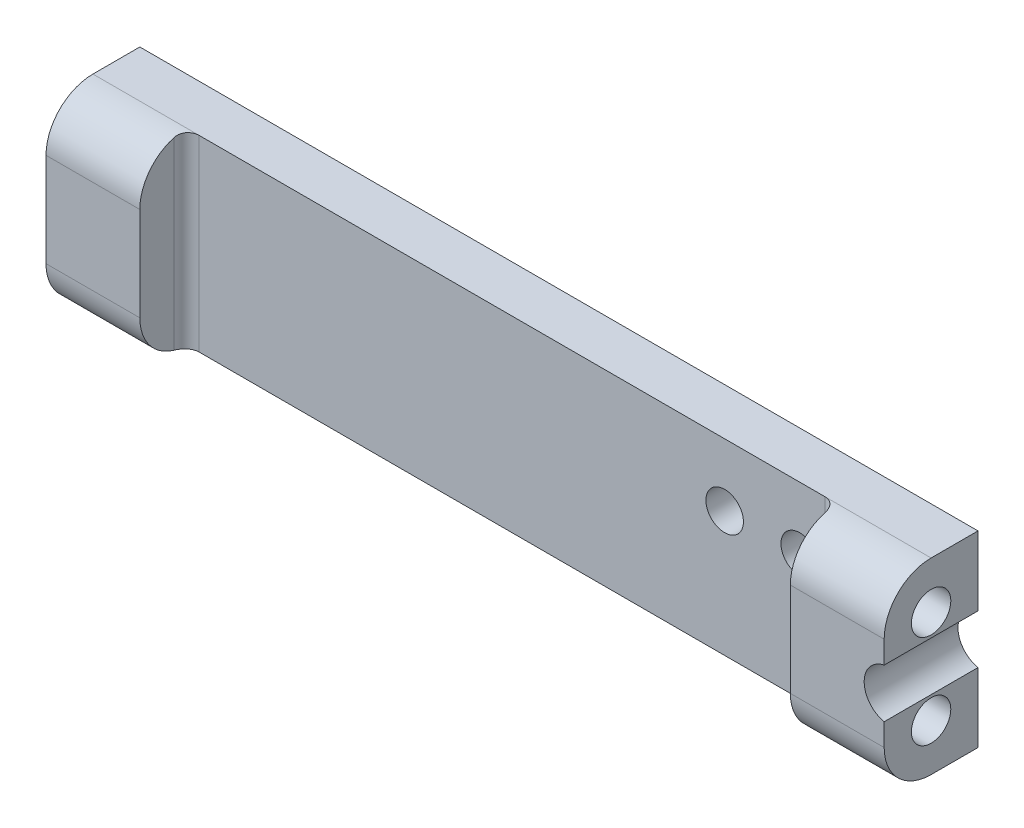
ISO-10303-21;
HEADER;
FILE_DESCRIPTION(('STEP AP214'),'2;1');
FILE_NAME('part.step','',(''),(''),'','','');
FILE_SCHEMA(('AUTOMOTIVE_DESIGN { 1 0 10303 214 1 1 1 1 }'));
ENDSEC;
DATA;
#1=APPLICATION_CONTEXT('core data for automotive mechanical design processes');
#2=APPLICATION_PROTOCOL_DEFINITION('international standard','automotive_design',2000,#1);
#3=PRODUCT_CONTEXT('',#1,'mechanical');
#4=PRODUCT('Part','Part','',(#3));
#5=PRODUCT_RELATED_PRODUCT_CATEGORY('part','',(#4));
#6=PRODUCT_DEFINITION_FORMATION('','',#4);
#7=PRODUCT_DEFINITION_CONTEXT('part definition',#1,'design');
#8=PRODUCT_DEFINITION('design','',#6,#7);
#9=PRODUCT_DEFINITION_SHAPE('','',#8);
#10=(LENGTH_UNIT() NAMED_UNIT(*) SI_UNIT(.MILLI.,.METRE.));
#11=(NAMED_UNIT(*) PLANE_ANGLE_UNIT() SI_UNIT($,.RADIAN.));
#12=(NAMED_UNIT(*) SI_UNIT($,.STERADIAN.) SOLID_ANGLE_UNIT());
#13=UNCERTAINTY_MEASURE_WITH_UNIT(LENGTH_MEASURE(1.E-05),#10,'distance_accuracy_value','');
#14=(GEOMETRIC_REPRESENTATION_CONTEXT(3) GLOBAL_UNCERTAINTY_ASSIGNED_CONTEXT((#13)) GLOBAL_UNIT_ASSIGNED_CONTEXT((#10,
#11,#12)) REPRESENTATION_CONTEXT('',''));
#15=CARTESIAN_POINT('',(0.,0.,0.));
#16=DIRECTION('',(0.,0.,1.));
#17=DIRECTION('',(1.,0.,0.));
#18=AXIS2_PLACEMENT_3D('',#15,#16,#17);
#19=CARTESIAN_POINT('',(53.281794946529,32.1184940800071,-52.0539798077196));
#20=DIRECTION('',(-1.,0.,0.));
#21=DIRECTION('',(0.,0.,1.));
#22=AXIS2_PLACEMENT_3D('',#19,#20,#21);
#23=PLANE('',#22);
#24=CARTESIAN_POINT('',(53.281794946529,46.4059940800071,-52.0539798077196));
#25=DIRECTION('',(-1.,0.,0.));
#26=DIRECTION('',(0.,0.,1.));
#27=AXIS2_PLACEMENT_3D('',#24,#25,#26);
#28=CIRCLE('',#27,2.);
#29=CARTESIAN_POINT('',(53.281794946529,46.4059940800071,-50.0539798077196));
#30=VERTEX_POINT('',#29);
#31=EDGE_CURVE('E381',#30,#30,#28,.T.);
#32=ORIENTED_EDGE('',*,*,#31,.T.);
#33=EDGE_LOOP('',(#32));
#34=FACE_BOUND('',#33,.T.);
#35=DIRECTION('',(0.,-1.,0.));
#36=VECTOR('',#35,1.);
#37=CARTESIAN_POINT('',(53.281794946529,32.1184940800071,-47.2914798077196));
#38=LINE('',#37,#36);
#39=CARTESIAN_POINT('',(53.281794946529,46.4059940800071,-47.2914798077196));
#40=VERTEX_POINT('',#39);
#41=CARTESIAN_POINT('',(53.281794946529,44.1321756586748,-47.2914798077196));
#42=VERTEX_POINT('',#41);
#43=EDGE_CURVE('E169',#40,#42,#38,.T.);
#44=ORIENTED_EDGE('',*,*,#43,.T.);
#45=DIRECTION('',(0.,0.,-1.));
#46=VECTOR('',#45,1.);
#47=CARTESIAN_POINT('',(53.281794946529,44.1321756586748,7.31852019228041));
#48=LINE('',#47,#46);
#49=CARTESIAN_POINT('',(53.281794946529,44.1321756586748,-56.8164798077196));
#50=VERTEX_POINT('',#49);
#51=EDGE_CURVE('E68',#42,#50,#48,.T.);
#52=ORIENTED_EDGE('',*,*,#51,.T.);
#53=DIRECTION('',(0.,1.,0.));
#54=VECTOR('',#53,1.);
#55=CARTESIAN_POINT('',(53.281794946529,32.1184940800071,-56.8164798077196));
#56=LINE('',#55,#54);
#57=CARTESIAN_POINT('',(53.281794946529,51.1684940800071,-56.8164798077196));
#58=VERTEX_POINT('',#57);
#59=EDGE_CURVE('E166',#50,#58,#56,.T.);
#60=ORIENTED_EDGE('',*,*,#59,.T.);
#61=DIRECTION('',(0.,0.,-1.));
#62=VECTOR('',#61,1.);
#63=CARTESIAN_POINT('',(53.281794946529,51.1684940800071,-52.0539798077196));
#64=LINE('',#63,#62);
#65=CARTESIAN_POINT('',(53.281794946529,51.1684940800071,-52.0539798077196));
#66=VERTEX_POINT('',#65);
#67=EDGE_CURVE('E193',#66,#58,#64,.T.);
#68=ORIENTED_EDGE('',*,*,#67,.F.);
#69=CARTESIAN_POINT('',(53.281794946529,46.4059940800071,-52.0539798077196));
#70=DIRECTION('',(-1.,0.,0.));
#71=DIRECTION('',(0.,0.,1.));
#72=AXIS2_PLACEMENT_3D('',#69,#70,#71);
#73=CIRCLE('',#72,4.7625);
#74=EDGE_CURVE('E324',#40,#66,#73,.T.);
#75=ORIENTED_EDGE('',*,*,#74,.F.);
#76=EDGE_LOOP('',(#44,#52,#60,#68,#75));
#77=FACE_BOUND('',#76,.T.);
#78=ADVANCED_FACE('F53',(#34,#77),#23,.F.);
#79=CARTESIAN_POINT('',(-31.808205053471,32.1184940800071,-52.0539798077196));
#80=DIRECTION('',(0.,0.,1.));
#81=DIRECTION('',(1.,0.,0.));
#82=AXIS2_PLACEMENT_3D('',#79,#80,#81);
#83=PLANE('',#82);
#84=CARTESIAN_POINT('',(32.3267949465289,44.8184940800071,-52.0539798077196));
#85=DIRECTION('',(0.,0.,1.));
#86=DIRECTION('',(1.,0.,0.));
#87=AXIS2_PLACEMENT_3D('',#84,#85,#86);
#88=CIRCLE('',#87,1.90500000000001);
#89=CARTESIAN_POINT('',(34.231794946529,44.8184940800071,-52.0539798077196));
#90=VERTEX_POINT('',#89);
#91=EDGE_CURVE('E203',#90,#90,#88,.T.);
#92=ORIENTED_EDGE('',*,*,#91,.F.);
#93=EDGE_LOOP('',(#92));
#94=FACE_BOUND('',#93,.T.);
#95=CARTESIAN_POINT('',(39.946794946529,44.8184940800071,-52.0539798077196));
#96=DIRECTION('',(0.,0.,1.));
#97=DIRECTION('',(1.,0.,0.));
#98=AXIS2_PLACEMENT_3D('',#95,#96,#97);
#99=CIRCLE('',#98,1.90500000000001);
#100=CARTESIAN_POINT('',(41.851794946529,44.8184940800071,-52.0539798077196));
#101=VERTEX_POINT('',#100);
#102=EDGE_CURVE('E170',#101,#101,#99,.T.);
#103=ORIENTED_EDGE('',*,*,#102,.F.);
#104=EDGE_LOOP('',(#103));
#105=FACE_BOUND('',#104,.T.);
#106=DIRECTION('',(1.,0.,0.));
#107=VECTOR('',#106,1.);
#108=CARTESIAN_POINT('',(-31.808205053471,32.1184940800071,-52.0539798077196));
#109=LINE('',#108,#107);
#110=CARTESIAN_POINT('',(-21.013205053471,32.1184940800071,-52.0539798077196));
#111=VERTEX_POINT('',#110);
#112=CARTESIAN_POINT('',(42.486794946529,32.1184940800071,-52.0539798077196));
#113=VERTEX_POINT('',#112);
#114=EDGE_CURVE('E293',#111,#113,#109,.T.);
#115=ORIENTED_EDGE('',*,*,#114,.T.);
#116=DIRECTION('',(0.,1.,0.));
#117=VECTOR('',#116,1.);
#118=CARTESIAN_POINT('',(42.486794946529,32.1184940800071,-52.0539798077196));
#119=LINE('',#118,#117);
#120=CARTESIAN_POINT('',(42.486794946529,51.1684940800071,-52.0539798077196));
#121=VERTEX_POINT('',#120);
#122=EDGE_CURVE('E198',#113,#121,#119,.T.);
#123=ORIENTED_EDGE('',*,*,#122,.T.);
#124=DIRECTION('',(1.,0.,0.));
#125=VECTOR('',#124,1.);
#126=CARTESIAN_POINT('',(-31.808205053471,51.1684940800071,-52.0539798077196));
#127=LINE('',#126,#125);
#128=CARTESIAN_POINT('',(-21.013205053471,51.1684940800071,-52.0539798077196));
#129=VERTEX_POINT('',#128);
#130=EDGE_CURVE('E76',#129,#121,#127,.T.);
#131=ORIENTED_EDGE('',*,*,#130,.F.);
#132=DIRECTION('',(0.,-1.,0.));
#133=VECTOR('',#132,1.);
#134=CARTESIAN_POINT('',(-21.013205053471,32.1184940800071,-52.0539798077196));
#135=LINE('',#134,#133);
#136=EDGE_CURVE('E210',#129,#111,#135,.T.);
#137=ORIENTED_EDGE('',*,*,#136,.T.);
#138=EDGE_LOOP('',(#115,#123,#131,#137));
#139=FACE_BOUND('',#138,.T.);
#140=ADVANCED_FACE('F248',(#94,#105,#139),#83,.T.);
#141=CARTESIAN_POINT('',(53.281794946529,36.8809940800071,-52.0539798077196));
#142=DIRECTION('',(1.,0.,0.));
#143=DIRECTION('',(0.,0.,-1.));
#144=AXIS2_PLACEMENT_3D('',#141,#142,#143);
#145=CIRCLE('',#144,2.);
#146=CARTESIAN_POINT('',(53.281794946529,36.8809940800071,-54.0539798077196));
#147=VERTEX_POINT('',#146);
#148=EDGE_CURVE('E206',#147,#147,#145,.T.);
#149=ORIENTED_EDGE('',*,*,#148,.F.);
#150=EDGE_LOOP('',(#149));
#151=FACE_BOUND('',#150,.T.);
#152=CARTESIAN_POINT('',(53.281794946529,32.1184940800071,-56.8164798077196));
#153=VERTEX_POINT('',#152);
#154=CARTESIAN_POINT('',(53.281794946529,39.1548125013394,-56.8164798077196));
#155=VERTEX_POINT('',#154);
#156=EDGE_CURVE('E176',#153,#155,#56,.T.);
#157=ORIENTED_EDGE('',*,*,#156,.T.);
#158=DIRECTION('',(0.,0.,-1.));
#159=VECTOR('',#158,1.);
#160=CARTESIAN_POINT('',(53.281794946529,39.1548125013394,7.31852019228041));
#161=LINE('',#160,#159);
#162=CARTESIAN_POINT('',(53.281794946529,39.1548125013394,-47.2914798077196));
#163=VERTEX_POINT('',#162);
#164=EDGE_CURVE('E157',#155,#163,#161,.F.);
#165=ORIENTED_EDGE('',*,*,#164,.T.);
#166=CARTESIAN_POINT('',(53.281794946529,36.8809940800071,-47.2914798077196));
#167=VERTEX_POINT('',#166);
#168=EDGE_CURVE('E323',#163,#167,#38,.T.);
#169=ORIENTED_EDGE('',*,*,#168,.T.);
#170=CARTESIAN_POINT('',(53.281794946529,36.8809940800071,-52.0539798077196));
#171=DIRECTION('',(1.,0.,0.));
#172=DIRECTION('',(0.,0.,-1.));
#173=AXIS2_PLACEMENT_3D('',#170,#171,#172);
#174=CIRCLE('',#173,4.7625);
#175=CARTESIAN_POINT('',(53.281794946529,32.1184940800071,-52.0539798077196));
#176=VERTEX_POINT('',#175);
#177=EDGE_CURVE('E327',#167,#176,#174,.T.);
#178=ORIENTED_EDGE('',*,*,#177,.T.);
#179=DIRECTION('',(0.,0.,-1.));
#180=VECTOR('',#179,1.);
#181=CARTESIAN_POINT('',(53.281794946529,32.1184940800071,-52.0539798077196));
#182=LINE('',#181,#180);
#183=EDGE_CURVE('E195',#176,#153,#182,.T.);
#184=ORIENTED_EDGE('',*,*,#183,.T.);
#185=EDGE_LOOP('',(#157,#165,#169,#178,#184));
#186=FACE_BOUND('',#185,.T.);
#187=ADVANCED_FACE('F244',(#151,#186),#23,.F.);
#188=CARTESIAN_POINT('',(-31.808205053471,32.1184940800071,-52.0539798077196));
#189=DIRECTION('',(-1.,0.,0.));
#190=DIRECTION('',(0.,0.,1.));
#191=AXIS2_PLACEMENT_3D('',#188,#189,#190);
#192=PLANE('',#191);
#193=CARTESIAN_POINT('',(-31.808205053471,36.8809940800071,-52.0539798077196));
#194=DIRECTION('',(1.,0.,0.));
#195=DIRECTION('',(0.,0.,-1.));
#196=AXIS2_PLACEMENT_3D('',#193,#194,#195);
#197=CIRCLE('',#196,2.);
#198=CARTESIAN_POINT('',(-31.808205053471,36.8809940800071,-54.0539798077196));
#199=VERTEX_POINT('',#198);
#200=EDGE_CURVE('E347',#199,#199,#197,.T.);
#201=ORIENTED_EDGE('',*,*,#200,.T.);
#202=EDGE_LOOP('',(#201));
#203=FACE_BOUND('',#202,.T.);
#204=DIRECTION('',(0.,0.,-1.));
#205=VECTOR('',#204,1.);
#206=CARTESIAN_POINT('',(-31.808205053471,51.1684940800071,-52.0539798077196));
#207=LINE('',#206,#205);
#208=CARTESIAN_POINT('',(-31.808205053471,51.1684940800071,-52.0539798077196));
#209=VERTEX_POINT('',#208);
#210=CARTESIAN_POINT('',(-31.808205053471,51.1684940800071,-56.8164798077196));
#211=VERTEX_POINT('',#210);
#212=EDGE_CURVE('E189',#209,#211,#207,.T.);
#213=ORIENTED_EDGE('',*,*,#212,.T.);
#214=DIRECTION('',(0.,1.,0.));
#215=VECTOR('',#214,1.);
#216=CARTESIAN_POINT('',(-31.808205053471,32.1184940800071,-56.8164798077196));
#217=LINE('',#216,#215);
#218=CARTESIAN_POINT('',(-31.808205053471,32.1184940800071,-56.8164798077196));
#219=VERTEX_POINT('',#218);
#220=EDGE_CURVE('E184',#219,#211,#217,.T.);
#221=ORIENTED_EDGE('',*,*,#220,.F.);
#222=DIRECTION('',(0.,0.,-1.));
#223=VECTOR('',#222,1.);
#224=CARTESIAN_POINT('',(-31.808205053471,32.1184940800071,-52.0539798077196));
#225=LINE('',#224,#223);
#226=CARTESIAN_POINT('',(-31.808205053471,32.1184940800071,-52.0539798077196));
#227=VERTEX_POINT('',#226);
#228=EDGE_CURVE('E187',#227,#219,#225,.T.);
#229=ORIENTED_EDGE('',*,*,#228,.F.);
#230=CARTESIAN_POINT('',(-31.808205053471,36.8809940800071,-52.0539798077196));
#231=DIRECTION('',(1.,0.,0.));
#232=DIRECTION('',(0.,0.,-1.));
#233=AXIS2_PLACEMENT_3D('',#230,#231,#232);
#234=CIRCLE('',#233,4.7625);
#235=CARTESIAN_POINT('',(-31.808205053471,36.8809940800071,-47.2914798077196));
#236=VERTEX_POINT('',#235);
#237=EDGE_CURVE('E343',#236,#227,#234,.T.);
#238=ORIENTED_EDGE('',*,*,#237,.F.);
#239=DIRECTION('',(0.,-1.,0.));
#240=VECTOR('',#239,1.);
#241=CARTESIAN_POINT('',(-31.808205053471,32.1184940800071,-47.2914798077196));
#242=LINE('',#241,#240);
#243=CARTESIAN_POINT('',(-31.808205053471,46.4059940800071,-47.2914798077196));
#244=VERTEX_POINT('',#243);
#245=EDGE_CURVE('E356',#244,#236,#242,.T.);
#246=ORIENTED_EDGE('',*,*,#245,.F.);
#247=CARTESIAN_POINT('',(-31.808205053471,46.4059940800071,-52.0539798077196));
#248=DIRECTION('',(-1.,0.,0.));
#249=DIRECTION('',(0.,0.,1.));
#250=AXIS2_PLACEMENT_3D('',#247,#248,#249);
#251=CIRCLE('',#250,4.7625);
#252=EDGE_CURVE('E362',#244,#209,#251,.T.);
#253=ORIENTED_EDGE('',*,*,#252,.T.);
#254=EDGE_LOOP('',(#213,#221,#229,#238,#246,#253));
#255=FACE_BOUND('',#254,.T.);
#256=CARTESIAN_POINT('',(-31.808205053471,46.4059940800071,-52.0539798077196));
#257=DIRECTION('',(-1.,0.,0.));
#258=DIRECTION('',(0.,0.,1.));
#259=AXIS2_PLACEMENT_3D('',#256,#257,#258);
#260=CIRCLE('',#259,2.);
#261=CARTESIAN_POINT('',(-31.808205053471,46.4059940800071,-50.0539798077196));
#262=VERTEX_POINT('',#261);
#263=EDGE_CURVE('E344',#262,#262,#260,.T.);
#264=ORIENTED_EDGE('',*,*,#263,.F.);
#265=EDGE_LOOP('',(#264));
#266=FACE_BOUND('',#265,.T.);
#267=ADVANCED_FACE('F247',(#203,#255,#266),#192,.T.);
#268=CARTESIAN_POINT('',(-31.808205053471,51.1684940800071,-52.0539798077196));
#269=DIRECTION('',(0.,1.,0.));
#270=DIRECTION('',(-1.,0.,0.));
#271=AXIS2_PLACEMENT_3D('',#268,#269,#270);
#272=PLANE('',#271);
#273=EDGE_CURVE('E190',#209,#129,#127,.T.);
#274=ORIENTED_EDGE('',*,*,#273,.T.);
#275=ORIENTED_EDGE('',*,*,#130,.T.);
#276=DIRECTION('',(1.,0.,0.));
#277=VECTOR('',#276,1.);
#278=CARTESIAN_POINT('',(43.7567949465289,51.1684940800071,-52.0539798077196));
#279=LINE('',#278,#277);
#280=EDGE_CURVE('E318',#66,#121,#279,.F.);
#281=ORIENTED_EDGE('',*,*,#280,.F.);
#282=ORIENTED_EDGE('',*,*,#67,.T.);
#283=DIRECTION('',(1.,0.,0.));
#284=VECTOR('',#283,1.);
#285=CARTESIAN_POINT('',(-31.808205053471,51.1684940800071,-56.8164798077196));
#286=LINE('',#285,#284);
#287=EDGE_CURVE('E174',#211,#58,#286,.T.);
#288=ORIENTED_EDGE('',*,*,#287,.F.);
#289=ORIENTED_EDGE('',*,*,#212,.F.);
#290=EDGE_LOOP('',(#274,#275,#281,#282,#288,#289));
#291=FACE_BOUND('',#290,.T.);
#292=ADVANCED_FACE('F243',(#291),#272,.T.);
#293=CARTESIAN_POINT('',(-31.808205053471,32.1184940800071,-56.8164798077196));
#294=DIRECTION('',(0.,0.,1.));
#295=DIRECTION('',(1.,0.,0.));
#296=AXIS2_PLACEMENT_3D('',#293,#294,#295);
#297=PLANE('',#296);
#298=CARTESIAN_POINT('',(32.3267949465289,44.8184940800071,-56.8164798077196));
#299=DIRECTION('',(0.,0.,1.));
#300=DIRECTION('',(1.,0.,0.));
#301=AXIS2_PLACEMENT_3D('',#298,#299,#300);
#302=CIRCLE('',#301,1.90500000000001);
#303=CARTESIAN_POINT('',(34.231794946529,44.8184940800071,-56.8164798077196));
#304=VERTEX_POINT('',#303);
#305=EDGE_CURVE('E202',#304,#304,#302,.T.);
#306=ORIENTED_EDGE('',*,*,#305,.T.);
#307=EDGE_LOOP('',(#306));
#308=FACE_BOUND('',#307,.T.);
#309=CARTESIAN_POINT('',(39.946794946529,44.8184940800071,-56.8164798077196));
#310=DIRECTION('',(0.,0.,1.));
#311=DIRECTION('',(1.,0.,0.));
#312=AXIS2_PLACEMENT_3D('',#309,#310,#311);
#313=CIRCLE('',#312,1.90500000000001);
#314=CARTESIAN_POINT('',(41.851794946529,44.8184940800071,-56.8164798077196));
#315=VERTEX_POINT('',#314);
#316=EDGE_CURVE('E199',#315,#315,#313,.T.);
#317=ORIENTED_EDGE('',*,*,#316,.T.);
#318=EDGE_LOOP('',(#317));
#319=FACE_BOUND('',#318,.T.);
#320=ORIENTED_EDGE('',*,*,#59,.F.);
#321=CARTESIAN_POINT('',(53.789794946529,41.6434940800071,-56.8164798077196));
#322=DIRECTION('',(0.,0.,-1.));
#323=DIRECTION('',(-1.,0.,0.));
#324=AXIS2_PLACEMENT_3D('',#321,#322,#323);
#325=CIRCLE('',#324,2.54);
#326=EDGE_CURVE('E154',#155,#50,#325,.T.);
#327=ORIENTED_EDGE('',*,*,#326,.F.);
#328=ORIENTED_EDGE('',*,*,#156,.F.);
#329=DIRECTION('',(1.,0.,0.));
#330=VECTOR('',#329,1.);
#331=CARTESIAN_POINT('',(-31.808205053471,32.1184940800071,-56.8164798077196));
#332=LINE('',#331,#330);
#333=EDGE_CURVE('E177',#219,#153,#332,.T.);
#334=ORIENTED_EDGE('',*,*,#333,.F.);
#335=ORIENTED_EDGE('',*,*,#220,.T.);
#336=ORIENTED_EDGE('',*,*,#287,.T.);
#337=EDGE_LOOP('',(#320,#327,#328,#334,#335,#336));
#338=FACE_BOUND('',#337,.T.);
#339=ADVANCED_FACE('F172',(#308,#319,#338),#297,.F.);
#340=CARTESIAN_POINT('',(-31.808205053471,32.1184940800071,-52.0539798077196));
#341=DIRECTION('',(0.,1.,0.));
#342=DIRECTION('',(-1.,0.,0.));
#343=AXIS2_PLACEMENT_3D('',#340,#341,#342);
#344=PLANE('',#343);
#345=ORIENTED_EDGE('',*,*,#333,.T.);
#346=ORIENTED_EDGE('',*,*,#183,.F.);
#347=EDGE_CURVE('E186',#113,#176,#109,.T.);
#348=ORIENTED_EDGE('',*,*,#347,.F.);
#349=ORIENTED_EDGE('',*,*,#114,.F.);
#350=EDGE_CURVE('E298',#227,#111,#109,.T.);
#351=ORIENTED_EDGE('',*,*,#350,.F.);
#352=ORIENTED_EDGE('',*,*,#228,.T.);
#353=EDGE_LOOP('',(#345,#346,#348,#349,#351,#352));
#354=FACE_BOUND('',#353,.T.);
#355=ADVANCED_FACE('F237',(#354),#344,.F.);
#356=CARTESIAN_POINT('',(-22.283205053471,32.1184940800071,-47.2914798077196));
#357=DIRECTION('',(0.,0.,-1.));
#358=DIRECTION('',(-1.,0.,0.));
#359=AXIS2_PLACEMENT_3D('',#356,#357,#358);
#360=PLANE('',#359);
#361=ORIENTED_EDGE('',*,*,#245,.T.);
#362=DIRECTION('',(-1.,0.,0.));
#363=VECTOR('',#362,1.);
#364=CARTESIAN_POINT('',(-22.283205053471,36.8809940800071,-47.2914798077196));
#365=LINE('',#364,#363);
#366=CARTESIAN_POINT('',(-22.283205053471,36.8809940800071,-47.2914798077196));
#367=VERTEX_POINT('',#366);
#368=EDGE_CURVE('E355',#367,#236,#365,.T.);
#369=ORIENTED_EDGE('',*,*,#368,.F.);
#370=DIRECTION('',(0.,-1.,0.));
#371=VECTOR('',#370,1.);
#372=CARTESIAN_POINT('',(-22.283205053471,32.1184940800071,-47.2914798077196));
#373=LINE('',#372,#371);
#374=CARTESIAN_POINT('',(-22.283205053471,46.4059940800071,-47.2914798077196));
#375=VERTEX_POINT('',#374);
#376=EDGE_CURVE('E352',#375,#367,#373,.T.);
#377=ORIENTED_EDGE('',*,*,#376,.F.);
#378=DIRECTION('',(-1.,0.,0.));
#379=VECTOR('',#378,1.);
#380=CARTESIAN_POINT('',(-22.283205053471,46.4059940800071,-47.2914798077196));
#381=LINE('',#380,#379);
#382=EDGE_CURVE('E179',#375,#244,#381,.T.);
#383=ORIENTED_EDGE('',*,*,#382,.T.);
#384=EDGE_LOOP('',(#361,#369,#377,#383));
#385=FACE_BOUND('',#384,.T.);
#386=ADVANCED_FACE('F241',(#385),#360,.F.);
#387=CARTESIAN_POINT('',(-22.283205053471,32.1184940800071,-56.8164798077196));
#388=DIRECTION('',(-1.,0.,0.));
#389=DIRECTION('',(0.,0.,1.));
#390=AXIS2_PLACEMENT_3D('',#387,#388,#389);
#391=PLANE('',#390);
#392=CARTESIAN_POINT('',(-22.283205053471,36.8809940800071,-52.0539798077196));
#393=DIRECTION('',(1.,0.,0.));
#394=DIRECTION('',(0.,0.,-1.));
#395=AXIS2_PLACEMENT_3D('',#392,#393,#394);
#396=CIRCLE('',#395,4.7625);
#397=CARTESIAN_POINT('',(-22.283205053471,32.2909498264078,-50.7839798077196));
#398=VERTEX_POINT('',#397);
#399=EDGE_CURVE('E364',#367,#398,#396,.T.);
#400=ORIENTED_EDGE('',*,*,#399,.T.);
#401=DIRECTION('',(0.,-1.,0.));
#402=VECTOR('',#401,1.);
#403=CARTESIAN_POINT('',(-22.283205053471,32.1184940800071,-50.7839798077196));
#404=LINE('',#403,#402);
#405=CARTESIAN_POINT('',(-22.283205053471,50.9960383336064,-50.7839798077196));
#406=VERTEX_POINT('',#405);
#407=EDGE_CURVE('E212',#398,#406,#404,.F.);
#408=ORIENTED_EDGE('',*,*,#407,.T.);
#409=CARTESIAN_POINT('',(-22.283205053471,46.4059940800071,-52.0539798077196));
#410=DIRECTION('',(-1.,0.,0.));
#411=DIRECTION('',(0.,0.,1.));
#412=AXIS2_PLACEMENT_3D('',#409,#410,#411);
#413=CIRCLE('',#412,4.7625);
#414=EDGE_CURVE('E288',#375,#406,#413,.T.);
#415=ORIENTED_EDGE('',*,*,#414,.F.);
#416=ORIENTED_EDGE('',*,*,#376,.T.);
#417=EDGE_LOOP('',(#400,#408,#415,#416));
#418=FACE_BOUND('',#417,.T.);
#419=ADVANCED_FACE('F267',(#418),#391,.F.);
#420=CARTESIAN_POINT('',(-22.283205053471,36.8809940800071,-52.0539798077196));
#421=DIRECTION('',(-1.,0.,0.));
#422=DIRECTION('',(0.,0.,1.));
#423=AXIS2_PLACEMENT_3D('',#420,#421,#422);
#424=CYLINDRICAL_SURFACE('',#423,4.7625);
#425=ORIENTED_EDGE('',*,*,#350,.T.);
#426=CARTESIAN_POINT('',(-21.013205053471,32.1184940800071,-52.0539798077196));
#427=CARTESIAN_POINT('',(-21.0489110338554,32.1184963897941,-52.0539795668819));
#428=CARTESIAN_POINT('',(-21.0845999155025,32.1184938201469,-52.052473055808));
#429=CARTESIAN_POINT('',(-21.1557227559325,32.1184986140629,-52.0464629353868));
#430=CARTESIAN_POINT('',(-21.1911567261077,32.1185059771793,-52.0419594608317));
#431=CARTESIAN_POINT('',(-21.2966427060577,32.1185724318406,-52.0239948283694));
#432=CARTESIAN_POINT('',(-21.3659889989472,32.1186757757917,-52.0060793533094));
#433=CARTESIAN_POINT('',(-21.5006917399608,32.1193860829967,-51.958866969165));
#434=CARTESIAN_POINT('',(-21.5660460972042,32.1199933077837,-51.9295641538237));
#435=CARTESIAN_POINT('',(-21.6908980677984,32.1223039124437,-51.8604183987805));
#436=CARTESIAN_POINT('',(-21.7503966555477,32.1240071095906,-51.8205772167424));
#437=CARTESIAN_POINT('',(-21.8616557421564,32.1292065584722,-51.7316552038856));
#438=CARTESIAN_POINT('',(-21.9134386877719,32.1326974723839,-51.6826021527378));
#439=CARTESIAN_POINT('',(-22.0079836727921,32.1421757518259,-51.5766671797731));
#440=CARTESIAN_POINT('',(-22.0507465971655,32.1481628722775,-51.5197860268896));
#441=CARTESIAN_POINT('',(-22.125596393424,32.1631329225431,-51.4007227690563));
#442=CARTESIAN_POINT('',(-22.1578064828574,32.1720786293185,-51.3386133402348));
#443=CARTESIAN_POINT('',(-22.211475368434,32.1933438004726,-51.210443615872));
#444=CARTESIAN_POINT('',(-22.232935275521,32.2056629160333,-51.1443837293684));
#445=CARTESIAN_POINT('',(-22.2603503976728,32.2298454929006,-51.0289551734812));
#446=CARTESIAN_POINT('',(-22.2689520952216,32.2408929553804,-50.9800223186616));
#447=CARTESIAN_POINT('',(-22.2803806901389,32.2646757554416,-50.8819800658191));
#448=CARTESIAN_POINT('',(-22.2832173446419,32.2774082022686,-50.8328711072385));
#449=CARTESIAN_POINT('',(-22.283205053471,32.2909498264078,-50.7839798077196));
#450=B_SPLINE_CURVE_WITH_KNOTS('',3,(#426,#427,#428,#429,#430,#431,#432,#433,#434,#435,#436,
#437,#438,#439,#440,#441,#442,#443,#444,#445,#446,#447,#448,#449),.UNSPECIFIED.,.F.,.F.,(4,2,2,
2,2,2,2,2,2,2,2,4),(0.,0.10705220425511,0.214099594027401,0.42786793512694,0.641747299473352,
0.855591013966786,1.06879991774659,1.28198789351664,1.49258969928329,1.70316973657486,
1.85551899002367,2.00761018221895),.UNSPECIFIED.);
#451=EDGE_CURVE('E271',#111,#398,#450,.T.);
#452=ORIENTED_EDGE('',*,*,#451,.T.);
#453=ORIENTED_EDGE('',*,*,#399,.F.);
#454=ORIENTED_EDGE('',*,*,#368,.T.);
#455=ORIENTED_EDGE('',*,*,#237,.T.);
#456=EDGE_LOOP('',(#425,#452,#453,#454,#455));
#457=FACE_BOUND('',#456,.T.);
#458=ADVANCED_FACE('F262',(#457),#424,.T.);
#459=CARTESIAN_POINT('',(-22.283205053471,46.4059940800071,-52.0539798077196));
#460=DIRECTION('',(-1.,0.,0.));
#461=DIRECTION('',(0.,0.,1.));
#462=AXIS2_PLACEMENT_3D('',#459,#460,#461);
#463=CYLINDRICAL_SURFACE('',#462,4.7625);
#464=ORIENTED_EDGE('',*,*,#414,.T.);
#465=CARTESIAN_POINT('',(-22.283205053471,50.9960383336064,-50.7839798077196));
#466=CARTESIAN_POINT('',(-22.2832048236796,51.0055366205166,-50.8183013427874));
#467=CARTESIAN_POINT('',(-22.2818126031884,51.0146421006051,-50.8527175349515));
#468=CARTESIAN_POINT('',(-22.2762064736814,51.0320321850672,-50.9215331954901));
#469=CARTESIAN_POINT('',(-22.2719920755471,51.0403166468624,-50.9559326599312));
#470=CARTESIAN_POINT('',(-22.2550728200245,51.0638626568632,-51.0586994472258));
#471=CARTESIAN_POINT('',(-22.2380920669238,51.0778389988024,-51.1267156441588));
#472=CARTESIAN_POINT('',(-22.1928573064481,51.1022730153779,-51.2596515387314));
#473=CARTESIAN_POINT('',(-22.1645855797414,51.1127251115127,-51.3245661888681));
#474=CARTESIAN_POINT('',(-22.0974176969639,51.1303435986814,-51.4490978614078));
#475=CARTESIAN_POINT('',(-22.0585273434548,51.1375117785032,-51.5087177536255));
#476=CARTESIAN_POINT('',(-21.9719767789899,51.1489809029582,-51.6197574000757));
#477=CARTESIAN_POINT('',(-21.9244885441162,51.1533315244537,-51.6713063418245));
#478=CARTESIAN_POINT('',(-21.8215913359984,51.1600147315096,-51.7659675520267));
#479=CARTESIAN_POINT('',(-21.766179742729,51.1623466477362,-51.8090770185745));
#480=CARTESIAN_POINT('',(-21.6485627505276,51.1656836011164,-51.8858836498724));
#481=CARTESIAN_POINT('',(-21.5863101810094,51.166678707446,-51.9195089193825));
#482=CARTESIAN_POINT('',(-21.4570956563577,51.1679390546835,-51.9759643238449));
#483=CARTESIAN_POINT('',(-21.390135658805,51.1682045971603,-51.9987989159444));
#484=CARTESIAN_POINT('',(-21.2713493626478,51.1684433970638,-52.0285548241821));
#485=CARTESIAN_POINT('',(-21.2201586048784,51.1684750372303,-52.0380787839643));
#486=CARTESIAN_POINT('',(-21.1170533147923,51.1684940021744,-52.0507938052154));
#487=CARTESIAN_POINT('',(-21.0651396281931,51.1684813750054,-52.0539917278691));
#488=CARTESIAN_POINT('',(-21.013205053471,51.1684940800071,-52.0539798077196));
#489=B_SPLINE_CURVE_WITH_KNOTS('',3,(#465,#466,#467,#468,#469,#470,#471,#472,#473,#474,#475,
#476,#477,#478,#479,#480,#481,#482,#483,#484,#485,#486,#487,#488),.UNSPECIFIED.,.F.,.F.,(4,2,2,
2,2,2,2,2,2,2,2,4),(0.,0.106776284798253,0.213571080047339,0.426913346542732,0.64059174270182,
0.854153606920951,1.06383949505144,1.27359488126875,1.48490002648238,1.69611781451615,
1.85195245343821,2.00761798210418),.UNSPECIFIED.);
#490=EDGE_CURVE('E62',#406,#129,#489,.T.);
#491=ORIENTED_EDGE('',*,*,#490,.T.);
#492=ORIENTED_EDGE('',*,*,#273,.F.);
#493=ORIENTED_EDGE('',*,*,#252,.F.);
#494=ORIENTED_EDGE('',*,*,#382,.F.);
#495=EDGE_LOOP('',(#464,#491,#492,#493,#494));
#496=FACE_BOUND('',#495,.T.);
#497=ADVANCED_FACE('F266',(#496),#463,.T.);
#498=CARTESIAN_POINT('',(-25.808205053471,36.8809940800071,-52.0539798077196));
#499=DIRECTION('',(-1.,0.,0.));
#500=DIRECTION('',(0.,0.,1.));
#501=AXIS2_PLACEMENT_3D('',#498,#499,#500);
#502=CYLINDRICAL_SURFACE('',#501,2.);
#503=CARTESIAN_POINT('',(-25.808205053471,36.8809940800071,-52.0539798077196));
#504=DIRECTION('',(1.,0.,0.));
#505=DIRECTION('',(0.,0.,-1.));
#506=AXIS2_PLACEMENT_3D('',#503,#504,#505);
#507=CIRCLE('',#506,2.);
#508=CARTESIAN_POINT('',(-25.808205053471,36.8809940800071,-54.0539798077196));
#509=VERTEX_POINT('',#508);
#510=EDGE_CURVE('E339',#509,#509,#507,.T.);
#511=ORIENTED_EDGE('',*,*,#510,.T.);
#512=EDGE_LOOP('',(#511));
#513=FACE_BOUND('',#512,.T.);
#514=ORIENTED_EDGE('',*,*,#200,.F.);
#515=EDGE_LOOP('',(#514));
#516=FACE_BOUND('',#515,.T.);
#517=ADVANCED_FACE('F455',(#513,#516),#502,.F.);
#518=CARTESIAN_POINT('',(-25.808205053471,36.8809940800071,-52.0539798077196));
#519=DIRECTION('',(1.,0.,0.));
#520=DIRECTION('',(0.,0.,-1.));
#521=AXIS2_PLACEMENT_3D('',#518,#519,#520);
#522=PLANE('',#521);
#523=ORIENTED_EDGE('',*,*,#510,.F.);
#524=EDGE_LOOP('',(#523));
#525=FACE_BOUND('',#524,.T.);
#526=ADVANCED_FACE('F453',(#525),#522,.F.);
#527=CARTESIAN_POINT('',(-25.808205053471,46.4059940800071,-52.0539798077196));
#528=DIRECTION('',(-1.,0.,0.));
#529=DIRECTION('',(0.,0.,1.));
#530=AXIS2_PLACEMENT_3D('',#527,#528,#529);
#531=CYLINDRICAL_SURFACE('',#530,2.);
#532=CARTESIAN_POINT('',(-25.808205053471,46.4059940800071,-52.0539798077196));
#533=DIRECTION('',(-1.,0.,0.));
#534=DIRECTION('',(0.,0.,1.));
#535=AXIS2_PLACEMENT_3D('',#532,#533,#534);
#536=CIRCLE('',#535,2.);
#537=CARTESIAN_POINT('',(-25.808205053471,46.4059940800071,-50.0539798077196));
#538=VERTEX_POINT('',#537);
#539=EDGE_CURVE('E340',#538,#538,#536,.T.);
#540=ORIENTED_EDGE('',*,*,#539,.F.);
#541=EDGE_LOOP('',(#540));
#542=FACE_BOUND('',#541,.T.);
#543=ORIENTED_EDGE('',*,*,#263,.T.);
#544=EDGE_LOOP('',(#543));
#545=FACE_BOUND('',#544,.T.);
#546=ADVANCED_FACE('F449',(#542,#545),#531,.F.);
#547=CARTESIAN_POINT('',(-25.808205053471,46.4059940800071,-52.0539798077196));
#548=DIRECTION('',(-1.,0.,0.));
#549=DIRECTION('',(0.,0.,1.));
#550=AXIS2_PLACEMENT_3D('',#547,#548,#549);
#551=PLANE('',#550);
#552=ORIENTED_EDGE('',*,*,#539,.T.);
#553=EDGE_LOOP('',(#552));
#554=FACE_BOUND('',#553,.T.);
#555=ADVANCED_FACE('F446',(#554),#551,.T.);
#556=CARTESIAN_POINT('',(43.7567949465289,46.4059940800071,-52.0539798077196));
#557=DIRECTION('',(1.,0.,0.));
#558=DIRECTION('',(0.,0.,-1.));
#559=AXIS2_PLACEMENT_3D('',#556,#557,#558);
#560=CYLINDRICAL_SURFACE('',#559,4.7625);
#561=ORIENTED_EDGE('',*,*,#74,.T.);
#562=ORIENTED_EDGE('',*,*,#280,.T.);
#563=CARTESIAN_POINT('',(42.486794946529,51.1684940800071,-52.0539798077196));
#564=CARTESIAN_POINT('',(42.5225009269133,51.1684917702201,-52.0539795668819));
#565=CARTESIAN_POINT('',(42.5581898085604,51.1684943398672,-52.052473055808));
#566=CARTESIAN_POINT('',(42.6293126489904,51.1684895459512,-52.0464629353868));
#567=CARTESIAN_POINT('',(42.6647466191657,51.1684821828348,-52.0419594608317));
#568=CARTESIAN_POINT('',(42.7702325991156,51.1684157281735,-52.0239948283694));
#569=CARTESIAN_POINT('',(42.8395788920051,51.1683123842224,-52.0060793533094));
#570=CARTESIAN_POINT('',(42.9742816330188,51.1676020770174,-51.958866969165));
#571=CARTESIAN_POINT('',(43.0396359902621,51.1669948522305,-51.9295641538237));
#572=CARTESIAN_POINT('',(43.1644879608563,51.1646842475704,-51.8604183987805));
#573=CARTESIAN_POINT('',(43.2239865486056,51.1629810504236,-51.8205772167424));
#574=CARTESIAN_POINT('',(43.3352456352143,51.157781601542,-51.7316552038855));
#575=CARTESIAN_POINT('',(43.3870285808298,51.1542906876302,-51.6826021527377));
#576=CARTESIAN_POINT('',(43.48157356585,51.1448124081883,-51.5766671797731));
#577=CARTESIAN_POINT('',(43.5243364902234,51.1388252877367,-51.5197860268896));
#578=CARTESIAN_POINT('',(43.5991862864819,51.1238552374711,-51.4007227690563));
#579=CARTESIAN_POINT('',(43.6313963759153,51.1149095306957,-51.3386133402348));
#580=CARTESIAN_POINT('',(43.6850652614919,51.0936443595416,-51.2104436158719));
#581=CARTESIAN_POINT('',(43.7065251685789,51.0813252439809,-51.1443837293684));
#582=CARTESIAN_POINT('',(43.7339402907307,51.0571426671135,-51.0289551734811));
#583=CARTESIAN_POINT('',(43.7425419882795,51.0460952046337,-50.9800223186616));
#584=CARTESIAN_POINT('',(43.7539705831968,51.0223124045725,-50.8819800658191));
#585=CARTESIAN_POINT('',(43.7568072376998,51.0095799577455,-50.8328711072385));
#586=CARTESIAN_POINT('',(43.7567949465289,50.9960383336064,-50.7839798077196));
#587=B_SPLINE_CURVE_WITH_KNOTS('',3,(#563,#564,#565,#566,#567,#568,#569,#570,#571,#572,#573,
#574,#575,#576,#577,#578,#579,#580,#581,#582,#583,#584,#585,#586),.UNSPECIFIED.,.F.,.F.,(4,2,2,
2,2,2,2,2,2,2,2,4),(0.,0.107052204255114,0.214099594027404,0.427867935126947,0.641747299473358,
0.855591013966801,1.0687999177466,1.28198789351665,1.4925896992833,1.70316973657487,
1.85551899002367,2.00761018221895),.UNSPECIFIED.);
#588=CARTESIAN_POINT('',(43.7567949465289,50.9960383336064,-50.7839798077196));
#589=VERTEX_POINT('',#588);
#590=EDGE_CURVE('E214',#121,#589,#587,.T.);
#591=ORIENTED_EDGE('',*,*,#590,.T.);
#592=CARTESIAN_POINT('',(43.7567949465289,46.4059940800071,-52.0539798077196));
#593=DIRECTION('',(-1.,0.,0.));
#594=DIRECTION('',(0.,0.,1.));
#595=AXIS2_PLACEMENT_3D('',#592,#593,#594);
#596=CIRCLE('',#595,4.7625);
#597=CARTESIAN_POINT('',(43.7567949465289,46.4059940800071,-47.2914798077196));
#598=VERTEX_POINT('',#597);
#599=EDGE_CURVE('E316',#598,#589,#596,.T.);
#600=ORIENTED_EDGE('',*,*,#599,.F.);
#601=DIRECTION('',(1.,0.,0.));
#602=VECTOR('',#601,1.);
#603=CARTESIAN_POINT('',(43.7567949465289,46.4059940800071,-47.2914798077196));
#604=LINE('',#603,#602);
#605=EDGE_CURVE('E332',#598,#40,#604,.T.);
#606=ORIENTED_EDGE('',*,*,#605,.T.);
#607=EDGE_LOOP('',(#561,#562,#591,#600,#606));
#608=FACE_BOUND('',#607,.T.);
#609=ADVANCED_FACE('F228',(#608),#560,.T.);
#610=CARTESIAN_POINT('',(43.7567949465289,32.1184940800071,-47.2914798077196));
#611=DIRECTION('',(0.,0.,1.));
#612=DIRECTION('',(1.,0.,0.));
#613=AXIS2_PLACEMENT_3D('',#610,#611,#612);
#614=PLANE('',#613);
#615=CARTESIAN_POINT('',(53.789794946529,41.6434940800071,-47.2914798077196));
#616=DIRECTION('',(0.,0.,1.));
#617=DIRECTION('',(1.,0.,0.));
#618=AXIS2_PLACEMENT_3D('',#615,#616,#617);
#619=CIRCLE('',#618,2.54);
#620=EDGE_CURVE('E11',#42,#163,#619,.T.);
#621=ORIENTED_EDGE('',*,*,#620,.F.);
#622=ORIENTED_EDGE('',*,*,#43,.F.);
#623=ORIENTED_EDGE('',*,*,#605,.F.);
#624=DIRECTION('',(0.,-1.,0.));
#625=VECTOR('',#624,1.);
#626=CARTESIAN_POINT('',(43.7567949465289,32.1184940800071,-47.2914798077196));
#627=LINE('',#626,#625);
#628=CARTESIAN_POINT('',(43.7567949465289,36.8809940800071,-47.2914798077196));
#629=VERTEX_POINT('',#628);
#630=EDGE_CURVE('E322',#598,#629,#627,.T.);
#631=ORIENTED_EDGE('',*,*,#630,.T.);
#632=DIRECTION('',(1.,0.,0.));
#633=VECTOR('',#632,1.);
#634=CARTESIAN_POINT('',(43.7567949465289,36.8809940800071,-47.2914798077196));
#635=LINE('',#634,#633);
#636=EDGE_CURVE('E334',#629,#167,#635,.T.);
#637=ORIENTED_EDGE('',*,*,#636,.T.);
#638=ORIENTED_EDGE('',*,*,#168,.F.);
#639=EDGE_LOOP('',(#621,#622,#623,#631,#637,#638));
#640=FACE_BOUND('',#639,.T.);
#641=ADVANCED_FACE('F369',(#640),#614,.T.);
#642=CARTESIAN_POINT('',(43.7567949465289,32.1184940800071,-56.8164798077196));
#643=DIRECTION('',(1.,0.,0.));
#644=DIRECTION('',(0.,0.,1.));
#645=AXIS2_PLACEMENT_3D('',#642,#643,#644);
#646=PLANE('',#645);
#647=ORIENTED_EDGE('',*,*,#599,.T.);
#648=DIRECTION('',(0.,1.,0.));
#649=VECTOR('',#648,1.);
#650=CARTESIAN_POINT('',(43.7567949465289,32.1184940800071,-50.7839798077196));
#651=LINE('',#650,#649);
#652=CARTESIAN_POINT('',(43.7567949465289,32.2909498264078,-50.7839798077196));
#653=VERTEX_POINT('',#652);
#654=EDGE_CURVE('E208',#589,#653,#651,.F.);
#655=ORIENTED_EDGE('',*,*,#654,.T.);
#656=CARTESIAN_POINT('',(43.7567949465289,36.8809940800071,-52.0539798077196));
#657=DIRECTION('',(1.,0.,0.));
#658=DIRECTION('',(0.,0.,-1.));
#659=AXIS2_PLACEMENT_3D('',#656,#657,#658);
#660=CIRCLE('',#659,4.7625);
#661=EDGE_CURVE('E309',#629,#653,#660,.T.);
#662=ORIENTED_EDGE('',*,*,#661,.F.);
#663=ORIENTED_EDGE('',*,*,#630,.F.);
#664=EDGE_LOOP('',(#647,#655,#662,#663));
#665=FACE_BOUND('',#664,.T.);
#666=ADVANCED_FACE('F321',(#665),#646,.F.);
#667=CARTESIAN_POINT('',(43.7567949465289,36.8809940800071,-52.0539798077196));
#668=DIRECTION('',(1.,0.,0.));
#669=DIRECTION('',(0.,0.,-1.));
#670=AXIS2_PLACEMENT_3D('',#667,#668,#669);
#671=CYLINDRICAL_SURFACE('',#670,4.7625);
#672=ORIENTED_EDGE('',*,*,#661,.T.);
#673=CARTESIAN_POINT('',(43.7567949465289,32.2909498264078,-50.7839798077196));
#674=CARTESIAN_POINT('',(43.7567947167375,32.2814515394975,-50.8183013427874));
#675=CARTESIAN_POINT('',(43.7554024962463,32.2723460594091,-50.8527175349515));
#676=CARTESIAN_POINT('',(43.7497963667393,32.254955974947,-50.9215331954901));
#677=CARTESIAN_POINT('',(43.745581968605,32.2466715131518,-50.9559326599312));
#678=CARTESIAN_POINT('',(43.7286627130824,32.2231255031509,-51.0586994472258));
#679=CARTESIAN_POINT('',(43.7116819599817,32.2091491612117,-51.1267156441588));
#680=CARTESIAN_POINT('',(43.666447199506,32.1847151446362,-51.2596515387314));
#681=CARTESIAN_POINT('',(43.6381754727993,32.1742630485014,-51.3245661888681));
#682=CARTESIAN_POINT('',(43.5710075900218,32.1566445613327,-51.4490978614078));
#683=CARTESIAN_POINT('',(43.5321172365127,32.1494763815109,-51.5087177536255));
#684=CARTESIAN_POINT('',(43.4455666720478,32.1380072570559,-51.6197574000757));
#685=CARTESIAN_POINT('',(43.3980784371741,32.1336566355604,-51.6713063418245));
#686=CARTESIAN_POINT('',(43.2951812290563,32.1269734285045,-51.7659675520267));
#687=CARTESIAN_POINT('',(43.2397696357869,32.1246415122779,-51.8090770185745));
#688=CARTESIAN_POINT('',(43.1221526435855,32.1213045588978,-51.8858836498724));
#689=CARTESIAN_POINT('',(43.0599000740673,32.1203094525682,-51.9195089193825));
#690=CARTESIAN_POINT('',(42.9306855494156,32.1190491053306,-51.9759643238449));
#691=CARTESIAN_POINT('',(42.8637255518629,32.1187835628538,-51.9987989159444));
#692=CARTESIAN_POINT('',(42.7449392557057,32.1185447629503,-52.0285548241821));
#693=CARTESIAN_POINT('',(42.6937484979363,32.1185131227839,-52.0380787839643));
#694=CARTESIAN_POINT('',(42.5906432078502,32.1184941578398,-52.0507938052154));
#695=CARTESIAN_POINT('',(42.538729521251,32.1185067850087,-52.0539917278691));
#696=CARTESIAN_POINT('',(42.486794946529,32.1184940800071,-52.0539798077196));
#697=B_SPLINE_CURVE_WITH_KNOTS('',3,(#673,#674,#675,#676,#677,#678,#679,#680,#681,#682,#683,
#684,#685,#686,#687,#688,#689,#690,#691,#692,#693,#694,#695,#696),.UNSPECIFIED.,.F.,.F.,(4,2,2,
2,2,2,2,2,2,2,2,4),(0.,0.106776284798251,0.213571080047331,0.426913346542731,0.640591742701809,
0.854153606920952,1.06383949505144,1.27359488126876,1.4849000264824,1.69611781451615,
1.85195245343821,2.00761798210418),.UNSPECIFIED.);
#698=EDGE_CURVE('E221',#653,#113,#697,.T.);
#699=ORIENTED_EDGE('',*,*,#698,.T.);
#700=ORIENTED_EDGE('',*,*,#347,.T.);
#701=ORIENTED_EDGE('',*,*,#177,.F.);
#702=ORIENTED_EDGE('',*,*,#636,.F.);
#703=EDGE_LOOP('',(#672,#699,#700,#701,#702));
#704=FACE_BOUND('',#703,.T.);
#705=ADVANCED_FACE('F304',(#704),#671,.T.);
#706=CARTESIAN_POINT('',(47.2817949465289,36.8809940800071,-52.0539798077196));
#707=DIRECTION('',(1.,0.,0.));
#708=DIRECTION('',(0.,0.,-1.));
#709=AXIS2_PLACEMENT_3D('',#706,#707,#708);
#710=CYLINDRICAL_SURFACE('',#709,2.);
#711=CARTESIAN_POINT('',(47.2817949465289,36.8809940800071,-52.0539798077196));
#712=DIRECTION('',(1.,0.,0.));
#713=DIRECTION('',(0.,0.,-1.));
#714=AXIS2_PLACEMENT_3D('',#711,#712,#713);
#715=CIRCLE('',#714,2.);
#716=CARTESIAN_POINT('',(47.2817949465289,36.8809940800071,-54.0539798077196));
#717=VERTEX_POINT('',#716);
#718=EDGE_CURVE('E384',#717,#717,#715,.T.);
#719=ORIENTED_EDGE('',*,*,#718,.F.);
#720=EDGE_LOOP('',(#719));
#721=FACE_BOUND('',#720,.T.);
#722=ORIENTED_EDGE('',*,*,#148,.T.);
#723=EDGE_LOOP('',(#722));
#724=FACE_BOUND('',#723,.T.);
#725=ADVANCED_FACE('F427',(#721,#724),#710,.F.);
#726=CARTESIAN_POINT('',(47.2817949465289,36.8809940800071,-52.0539798077196));
#727=DIRECTION('',(-1.,0.,0.));
#728=DIRECTION('',(0.,0.,-1.));
#729=AXIS2_PLACEMENT_3D('',#726,#727,#728);
#730=PLANE('',#729);
#731=ORIENTED_EDGE('',*,*,#718,.T.);
#732=EDGE_LOOP('',(#731));
#733=FACE_BOUND('',#732,.T.);
#734=ADVANCED_FACE('F416',(#733),#730,.F.);
#735=CARTESIAN_POINT('',(47.2817949465289,46.4059940800071,-52.0539798077196));
#736=DIRECTION('',(1.,0.,0.));
#737=DIRECTION('',(0.,0.,-1.));
#738=AXIS2_PLACEMENT_3D('',#735,#736,#737);
#739=CYLINDRICAL_SURFACE('',#738,2.);
#740=CARTESIAN_POINT('',(47.2817949465289,46.4059940800071,-52.0539798077196));
#741=DIRECTION('',(-1.,0.,0.));
#742=DIRECTION('',(0.,0.,1.));
#743=AXIS2_PLACEMENT_3D('',#740,#741,#742);
#744=CIRCLE('',#743,2.);
#745=CARTESIAN_POINT('',(47.2817949465289,46.4059940800071,-50.0539798077196));
#746=VERTEX_POINT('',#745);
#747=EDGE_CURVE('E378',#746,#746,#744,.T.);
#748=ORIENTED_EDGE('',*,*,#747,.T.);
#749=EDGE_LOOP('',(#748));
#750=FACE_BOUND('',#749,.T.);
#751=ORIENTED_EDGE('',*,*,#31,.F.);
#752=EDGE_LOOP('',(#751));
#753=FACE_BOUND('',#752,.T.);
#754=ADVANCED_FACE('F413',(#750,#753),#739,.F.);
#755=CARTESIAN_POINT('',(47.2817949465289,46.4059940800071,-52.0539798077196));
#756=DIRECTION('',(1.,0.,0.));
#757=DIRECTION('',(0.,0.,1.));
#758=AXIS2_PLACEMENT_3D('',#755,#756,#757);
#759=PLANE('',#758);
#760=ORIENTED_EDGE('',*,*,#747,.F.);
#761=EDGE_LOOP('',(#760));
#762=FACE_BOUND('',#761,.T.);
#763=ADVANCED_FACE('F415',(#762),#759,.T.);
#764=CARTESIAN_POINT('',(39.946794946529,44.8184940800071,-58.4039798077196));
#765=DIRECTION('',(0.,0.,1.));
#766=DIRECTION('',(1.,0.,0.));
#767=AXIS2_PLACEMENT_3D('',#764,#765,#766);
#768=CYLINDRICAL_SURFACE('',#767,1.90500000000001);
#769=ORIENTED_EDGE('',*,*,#102,.T.);
#770=EDGE_LOOP('',(#769));
#771=FACE_BOUND('',#770,.T.);
#772=ORIENTED_EDGE('',*,*,#316,.F.);
#773=EDGE_LOOP('',(#772));
#774=FACE_BOUND('',#773,.T.);
#775=ADVANCED_FACE('F424',(#771,#774),#768,.F.);
#776=CARTESIAN_POINT('',(32.3267949465289,44.8184940800071,-58.4039798077196));
#777=DIRECTION('',(0.,0.,1.));
#778=DIRECTION('',(1.,0.,0.));
#779=AXIS2_PLACEMENT_3D('',#776,#777,#778);
#780=CYLINDRICAL_SURFACE('',#779,1.90500000000001);
#781=ORIENTED_EDGE('',*,*,#91,.T.);
#782=EDGE_LOOP('',(#781));
#783=FACE_BOUND('',#782,.T.);
#784=ORIENTED_EDGE('',*,*,#305,.F.);
#785=EDGE_LOOP('',(#784));
#786=FACE_BOUND('',#785,.T.);
#787=ADVANCED_FACE('F235',(#783,#786),#780,.F.);
#788=CARTESIAN_POINT('',(42.486794946529,32.1184940800071,-50.7839798077196));
#789=DIRECTION('',(0.,1.,0.));
#790=DIRECTION('',(-1.,0.,0.));
#791=AXIS2_PLACEMENT_3D('',#788,#789,#790);
#792=CYLINDRICAL_SURFACE('',#791,1.27);
#793=ORIENTED_EDGE('',*,*,#698,.F.);
#794=ORIENTED_EDGE('',*,*,#654,.F.);
#795=ORIENTED_EDGE('',*,*,#590,.F.);
#796=ORIENTED_EDGE('',*,*,#122,.F.);
#797=EDGE_LOOP('',(#793,#794,#795,#796));
#798=FACE_BOUND('',#797,.T.);
#799=ADVANCED_FACE('F231',(#798),#792,.F.);
#800=CARTESIAN_POINT('',(-21.013205053471,32.1184940800071,-50.7839798077196));
#801=DIRECTION('',(0.,-1.,0.));
#802=DIRECTION('',(1.,0.,0.));
#803=AXIS2_PLACEMENT_3D('',#800,#801,#802);
#804=CYLINDRICAL_SURFACE('',#803,1.27);
#805=ORIENTED_EDGE('',*,*,#490,.F.);
#806=ORIENTED_EDGE('',*,*,#407,.F.);
#807=ORIENTED_EDGE('',*,*,#451,.F.);
#808=ORIENTED_EDGE('',*,*,#136,.F.);
#809=EDGE_LOOP('',(#805,#806,#807,#808));
#810=FACE_BOUND('',#809,.T.);
#811=ADVANCED_FACE('F55',(#810),#804,.F.);
#812=CARTESIAN_POINT('',(53.789794946529,41.6434940800071,7.31852019228041));
#813=DIRECTION('',(0.,0.,-1.));
#814=DIRECTION('',(-1.,0.,0.));
#815=AXIS2_PLACEMENT_3D('',#812,#813,#814);
#816=CYLINDRICAL_SURFACE('',#815,2.54);
#817=ORIENTED_EDGE('',*,*,#620,.T.);
#818=ORIENTED_EDGE('',*,*,#164,.F.);
#819=ORIENTED_EDGE('',*,*,#326,.T.);
#820=ORIENTED_EDGE('',*,*,#51,.F.);
#821=EDGE_LOOP('',(#817,#818,#819,#820));
#822=FACE_BOUND('',#821,.T.);
#823=ADVANCED_FACE('F155',(#822),#816,.F.);
#824=CLOSED_SHELL('',(#78,#140,#187,#267,#292,#339,#355,#386,#419,#458,#497,#517,#526,#546,#555,
#609,#641,#666,#705,#725,#734,#754,#763,#775,#787,#799,#811,#823));
#825=MANIFOLD_SOLID_BREP('B2',#824);
#826=ADVANCED_BREP_SHAPE_REPRESENTATION('',(#18,#825),#14);
#827=SHAPE_DEFINITION_REPRESENTATION(#9,#826);
ENDSEC;
END-ISO-10303-21;
